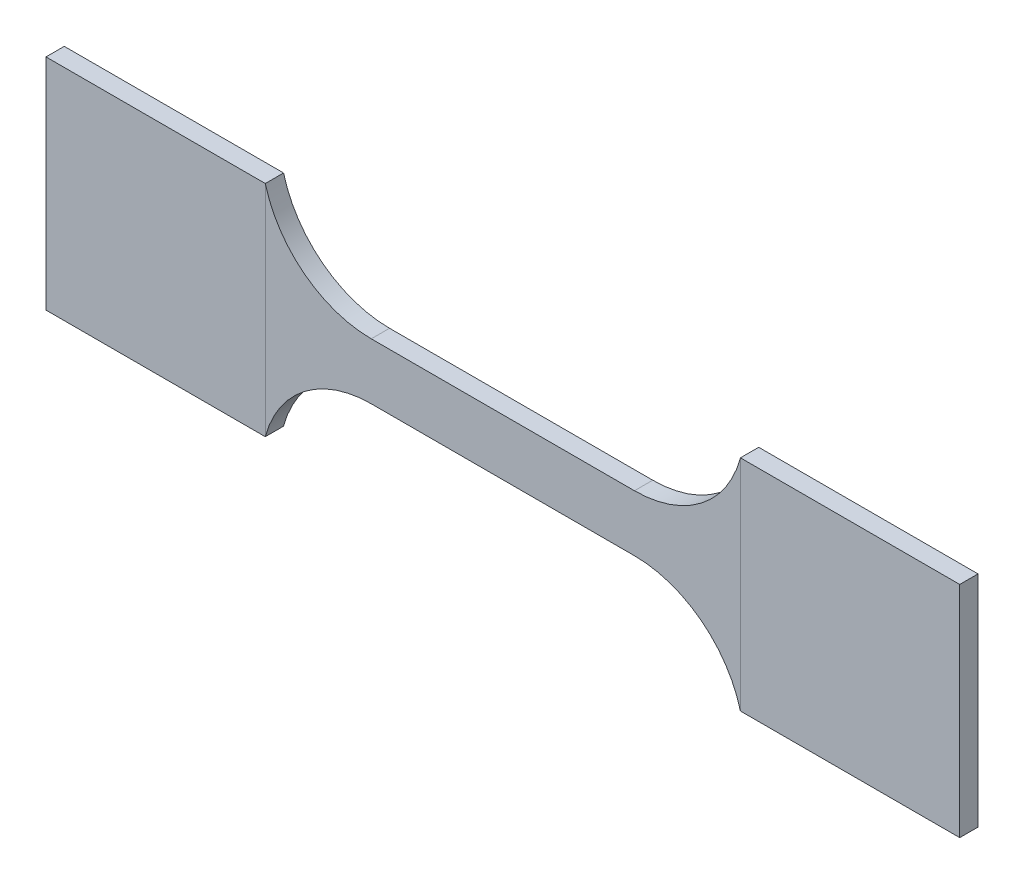
ISO-10303-21;
HEADER;
FILE_DESCRIPTION(('STEP AP214'),'2;1');
FILE_NAME('part.step','',(''),(''),'','','');
FILE_SCHEMA(('AUTOMOTIVE_DESIGN { 1 0 10303 214 1 1 1 1 }'));
ENDSEC;
DATA;
#1=APPLICATION_CONTEXT('core data for automotive mechanical design processes');
#2=APPLICATION_PROTOCOL_DEFINITION('international standard','automotive_design',2000,#1);
#3=PRODUCT_CONTEXT('',#1,'mechanical');
#4=PRODUCT('Part','Part','',(#3));
#5=PRODUCT_RELATED_PRODUCT_CATEGORY('part','',(#4));
#6=PRODUCT_DEFINITION_FORMATION('','',#4);
#7=PRODUCT_DEFINITION_CONTEXT('part definition',#1,'design');
#8=PRODUCT_DEFINITION('design','',#6,#7);
#9=PRODUCT_DEFINITION_SHAPE('','',#8);
#10=(LENGTH_UNIT() NAMED_UNIT(*) SI_UNIT(.MILLI.,.METRE.));
#11=(NAMED_UNIT(*) PLANE_ANGLE_UNIT() SI_UNIT($,.RADIAN.));
#12=(NAMED_UNIT(*) SI_UNIT($,.STERADIAN.) SOLID_ANGLE_UNIT());
#13=UNCERTAINTY_MEASURE_WITH_UNIT(LENGTH_MEASURE(1.E-05),#10,'distance_accuracy_value','');
#14=(GEOMETRIC_REPRESENTATION_CONTEXT(3) GLOBAL_UNCERTAINTY_ASSIGNED_CONTEXT((#13)) GLOBAL_UNIT_ASSIGNED_CONTEXT((#10,
#11,#12)) REPRESENTATION_CONTEXT('',''));
#15=CARTESIAN_POINT('',(0.,0.,0.));
#16=DIRECTION('',(0.,0.,1.));
#17=DIRECTION('',(1.,0.,0.));
#18=AXIS2_PLACEMENT_3D('',#15,#16,#17);
#19=CARTESIAN_POINT('',(7.80648251110733,36.82308604997,-0.01));
#20=DIRECTION('',(-1.,0.,0.));
#21=DIRECTION('',(0.,-1.,0.));
#22=AXIS2_PLACEMENT_3D('',#19,#20,#21);
#23=PLANE('',#22);
#24=DIRECTION('',(0.,1.,0.));
#25=VECTOR('',#24,1.);
#26=CARTESIAN_POINT('',(7.80648251110733,2.97308604996999,0.));
#27=LINE('',#26,#25);
#28=CARTESIAN_POINT('',(7.80648251110733,6.82308604996999,0.));
#29=VERTEX_POINT('',#28);
#30=CARTESIAN_POINT('',(7.80648251110733,36.82308604997,0.));
#31=VERTEX_POINT('',#30);
#32=EDGE_CURVE('E109',#29,#31,#27,.T.);
#33=ORIENTED_EDGE('',*,*,#32,.F.);
#34=DIRECTION('',(0.,0.,-1.));
#35=VECTOR('',#34,1.);
#36=CARTESIAN_POINT('',(7.80648251110733,6.82308604996999,2.5));
#37=LINE('',#36,#35);
#38=CARTESIAN_POINT('',(7.80648251110733,6.82308604996999,2.5));
#39=VERTEX_POINT('',#38);
#40=EDGE_CURVE('E68',#39,#29,#37,.T.);
#41=ORIENTED_EDGE('',*,*,#40,.F.);
#42=DIRECTION('',(0.,1.,0.));
#43=VECTOR('',#42,1.);
#44=CARTESIAN_POINT('',(7.80648251110733,2.97308604996999,2.5));
#45=LINE('',#44,#43);
#46=CARTESIAN_POINT('',(7.80648251110733,36.82308604997,2.5));
#47=VERTEX_POINT('',#46);
#48=EDGE_CURVE('E111',#39,#47,#45,.T.);
#49=ORIENTED_EDGE('',*,*,#48,.T.);
#50=DIRECTION('',(0.,0.,-1.));
#51=VECTOR('',#50,1.);
#52=CARTESIAN_POINT('',(7.80648251110733,36.82308604997,2.5));
#53=LINE('',#52,#51);
#54=EDGE_CURVE('E53',#47,#31,#53,.T.);
#55=ORIENTED_EDGE('',*,*,#54,.T.);
#56=EDGE_LOOP('',(#33,#41,#49,#55));
#57=FACE_BOUND('',#56,.T.);
#58=ADVANCED_FACE('F49',(#57),#23,.T.);
#59=CARTESIAN_POINT('',(37.8064825111073,6.82308604996999,2.5));
#60=DIRECTION('',(-1.,0.,0.));
#61=DIRECTION('',(0.,0.,1.));
#62=AXIS2_PLACEMENT_3D('',#59,#60,#61);
#63=PLANE('',#62);
#64=DIRECTION('',(0.,1.,0.));
#65=VECTOR('',#64,1.);
#66=CARTESIAN_POINT('',(37.8064825111073,6.82308604996999,0.));
#67=LINE('',#66,#65);
#68=CARTESIAN_POINT('',(37.8064825111073,6.82308604996999,0.));
#69=VERTEX_POINT('',#68);
#70=CARTESIAN_POINT('',(37.8064825111073,36.82308604997,0.));
#71=VERTEX_POINT('',#70);
#72=EDGE_CURVE('E60',#69,#71,#67,.T.);
#73=ORIENTED_EDGE('',*,*,#72,.T.);
#74=DIRECTION('',(0.,0.,-1.));
#75=VECTOR('',#74,1.);
#76=CARTESIAN_POINT('',(37.8064825111073,36.82308604997,2.5));
#77=LINE('',#76,#75);
#78=CARTESIAN_POINT('',(37.8064825111073,36.82308604997,2.5));
#79=VERTEX_POINT('',#78);
#80=EDGE_CURVE('E104',#79,#71,#77,.T.);
#81=ORIENTED_EDGE('',*,*,#80,.F.);
#82=DIRECTION('',(0.,1.,0.));
#83=VECTOR('',#82,1.);
#84=CARTESIAN_POINT('',(37.8064825111073,6.82308604996999,2.5));
#85=LINE('',#84,#83);
#86=CARTESIAN_POINT('',(37.8064825111073,6.82308604996999,2.5));
#87=VERTEX_POINT('',#86);
#88=EDGE_CURVE('E121',#87,#79,#85,.T.);
#89=ORIENTED_EDGE('',*,*,#88,.F.);
#90=DIRECTION('',(0.,0.,-1.));
#91=VECTOR('',#90,1.);
#92=CARTESIAN_POINT('',(37.8064825111073,6.82308604996999,2.5));
#93=LINE('',#92,#91);
#94=EDGE_CURVE('E118',#87,#69,#93,.T.);
#95=ORIENTED_EDGE('',*,*,#94,.T.);
#96=EDGE_LOOP('',(#73,#81,#89,#95));
#97=FACE_BOUND('',#96,.T.);
#98=ADVANCED_FACE('F133',(#97),#63,.F.);
#99=CARTESIAN_POINT('',(37.8064825111073,36.82308604997,2.5));
#100=DIRECTION('',(0.,-1.,0.));
#101=DIRECTION('',(0.,0.,-1.));
#102=AXIS2_PLACEMENT_3D('',#99,#100,#101);
#103=PLANE('',#102);
#104=DIRECTION('',(-1.,0.,0.));
#105=VECTOR('',#104,1.);
#106=CARTESIAN_POINT('',(37.8064825111073,36.82308604997,0.));
#107=LINE('',#106,#105);
#108=EDGE_CURVE('E99',#71,#31,#107,.T.);
#109=ORIENTED_EDGE('',*,*,#108,.T.);
#110=ORIENTED_EDGE('',*,*,#54,.F.);
#111=DIRECTION('',(-1.,0.,0.));
#112=VECTOR('',#111,1.);
#113=CARTESIAN_POINT('',(37.8064825111073,36.82308604997,2.5));
#114=LINE('',#113,#112);
#115=EDGE_CURVE('E124',#79,#47,#114,.T.);
#116=ORIENTED_EDGE('',*,*,#115,.F.);
#117=ORIENTED_EDGE('',*,*,#80,.T.);
#118=EDGE_LOOP('',(#109,#110,#116,#117));
#119=FACE_BOUND('',#118,.T.);
#120=ADVANCED_FACE('F101',(#119),#103,.F.);
#121=CARTESIAN_POINT('',(37.8064825111073,6.82308604996999,2.5));
#122=DIRECTION('',(0.,1.,0.));
#123=DIRECTION('',(0.,0.,1.));
#124=AXIS2_PLACEMENT_3D('',#121,#122,#123);
#125=PLANE('',#124);
#126=DIRECTION('',(1.,0.,0.));
#127=VECTOR('',#126,1.);
#128=CARTESIAN_POINT('',(37.8064825111073,6.82308604996999,0.));
#129=LINE('',#128,#127);
#130=EDGE_CURVE('E12',#29,#69,#129,.T.);
#131=ORIENTED_EDGE('',*,*,#130,.T.);
#132=ORIENTED_EDGE('',*,*,#94,.F.);
#133=DIRECTION('',(1.,0.,0.));
#134=VECTOR('',#133,1.);
#135=CARTESIAN_POINT('',(37.8064825111073,6.82308604996999,2.5));
#136=LINE('',#135,#134);
#137=EDGE_CURVE('E81',#39,#87,#136,.T.);
#138=ORIENTED_EDGE('',*,*,#137,.F.);
#139=ORIENTED_EDGE('',*,*,#40,.T.);
#140=EDGE_LOOP('',(#131,#132,#138,#139));
#141=FACE_BOUND('',#140,.T.);
#142=ADVANCED_FACE('F134',(#141),#125,.F.);
#143=CARTESIAN_POINT('',(-42.6910172733383,2.97308604996999,0.));
#144=DIRECTION('',(0.,0.,-1.));
#145=DIRECTION('',(-1.,0.,0.));
#146=AXIS2_PLACEMENT_3D('',#143,#144,#145);
#147=PLANE('',#146);
#148=ORIENTED_EDGE('',*,*,#130,.F.);
#149=ORIENTED_EDGE('',*,*,#32,.T.);
#150=ORIENTED_EDGE('',*,*,#108,.F.);
#151=ORIENTED_EDGE('',*,*,#72,.F.);
#152=EDGE_LOOP('',(#148,#149,#150,#151));
#153=FACE_BOUND('',#152,.T.);
#154=ADVANCED_FACE('F51',(#153),#147,.T.);
#155=CARTESIAN_POINT('',(-42.6910172733383,2.97308604996999,2.5));
#156=DIRECTION('',(0.,0.,-1.));
#157=DIRECTION('',(-1.,0.,0.));
#158=AXIS2_PLACEMENT_3D('',#155,#156,#157);
#159=PLANE('',#158);
#160=ORIENTED_EDGE('',*,*,#48,.F.);
#161=ORIENTED_EDGE('',*,*,#137,.T.);
#162=ORIENTED_EDGE('',*,*,#88,.T.);
#163=ORIENTED_EDGE('',*,*,#115,.T.);
#164=EDGE_LOOP('',(#160,#161,#162,#163));
#165=FACE_BOUND('',#164,.T.);
#166=ADVANCED_FACE('F141',(#165),#159,.F.);
#167=CLOSED_SHELL('',(#58,#98,#120,#142,#154,#166));
#168=MANIFOLD_SOLID_BREP('B2',#167);
#169=CARTESIAN_POINT('',(-57.1885170577839,36.82308604997,-0.01));
#170=DIRECTION('',(-1.,0.,0.));
#171=DIRECTION('',(0.,0.,1.));
#172=AXIS2_PLACEMENT_3D('',#169,#170,#171);
#173=PLANE('',#172);
#174=DIRECTION('',(0.,1.,0.));
#175=VECTOR('',#174,1.);
#176=CARTESIAN_POINT('',(-57.1885170577839,2.97308604996999,0.));
#177=LINE('',#176,#175);
#178=CARTESIAN_POINT('',(-57.1885170577839,6.82308604996999,0.));
#179=VERTEX_POINT('',#178);
#180=CARTESIAN_POINT('',(-57.1885170577839,36.82308604997,0.));
#181=VERTEX_POINT('',#180);
#182=EDGE_CURVE('E244',#179,#181,#177,.T.);
#183=ORIENTED_EDGE('',*,*,#182,.T.);
#184=DIRECTION('',(0.,0.,-1.));
#185=VECTOR('',#184,1.);
#186=CARTESIAN_POINT('',(-57.1885170577839,36.82308604997,2.5));
#187=LINE('',#186,#185);
#188=CARTESIAN_POINT('',(-57.1885170577839,36.82308604997,2.5));
#189=VERTEX_POINT('',#188);
#190=EDGE_CURVE('E212',#189,#181,#187,.T.);
#191=ORIENTED_EDGE('',*,*,#190,.F.);
#192=DIRECTION('',(0.,1.,0.));
#193=VECTOR('',#192,1.);
#194=CARTESIAN_POINT('',(-57.1885170577839,2.97308604996999,2.5));
#195=LINE('',#194,#193);
#196=CARTESIAN_POINT('',(-57.1885170577839,6.82308604996999,2.5));
#197=VERTEX_POINT('',#196);
#198=EDGE_CURVE('E229',#197,#189,#195,.T.);
#199=ORIENTED_EDGE('',*,*,#198,.F.);
#200=DIRECTION('',(0.,0.,-1.));
#201=VECTOR('',#200,1.);
#202=CARTESIAN_POINT('',(-57.1885170577839,6.82308604996999,2.5));
#203=LINE('',#202,#201);
#204=EDGE_CURVE('E197',#197,#179,#203,.T.);
#205=ORIENTED_EDGE('',*,*,#204,.T.);
#206=EDGE_LOOP('',(#183,#191,#199,#205));
#207=FACE_BOUND('',#206,.T.);
#208=ADVANCED_FACE('F193',(#207),#173,.F.);
#209=CARTESIAN_POINT('',(-87.1885170577839,6.82308604996999,2.5));
#210=DIRECTION('',(0.,1.,0.));
#211=DIRECTION('',(0.,0.,1.));
#212=AXIS2_PLACEMENT_3D('',#209,#210,#211);
#213=PLANE('',#212);
#214=DIRECTION('',(1.,0.,0.));
#215=VECTOR('',#214,1.);
#216=CARTESIAN_POINT('',(-87.1885170577839,6.82308604996999,0.));
#217=LINE('',#216,#215);
#218=CARTESIAN_POINT('',(-87.1885170577839,6.82308604996999,0.));
#219=VERTEX_POINT('',#218);
#220=EDGE_CURVE('E47',#219,#179,#217,.T.);
#221=ORIENTED_EDGE('',*,*,#220,.T.);
#222=ORIENTED_EDGE('',*,*,#204,.F.);
#223=DIRECTION('',(1.,0.,0.));
#224=VECTOR('',#223,1.);
#225=CARTESIAN_POINT('',(-87.1885170577839,6.82308604996999,2.5));
#226=LINE('',#225,#224);
#227=CARTESIAN_POINT('',(-87.1885170577839,6.82308604996999,2.5));
#228=VERTEX_POINT('',#227);
#229=EDGE_CURVE('E253',#228,#197,#226,.T.);
#230=ORIENTED_EDGE('',*,*,#229,.F.);
#231=DIRECTION('',(0.,0.,-1.));
#232=VECTOR('',#231,1.);
#233=CARTESIAN_POINT('',(-87.1885170577839,6.82308604996999,2.5));
#234=LINE('',#233,#232);
#235=EDGE_CURVE('E252',#228,#219,#234,.T.);
#236=ORIENTED_EDGE('',*,*,#235,.T.);
#237=EDGE_LOOP('',(#221,#222,#230,#236));
#238=FACE_BOUND('',#237,.T.);
#239=ADVANCED_FACE('F251',(#238),#213,.F.);
#240=CARTESIAN_POINT('',(-87.1885170577839,36.82308604997,2.5));
#241=DIRECTION('',(0.,-1.,0.));
#242=DIRECTION('',(0.,0.,-1.));
#243=AXIS2_PLACEMENT_3D('',#240,#241,#242);
#244=PLANE('',#243);
#245=DIRECTION('',(-1.,0.,0.));
#246=VECTOR('',#245,1.);
#247=CARTESIAN_POINT('',(-87.1885170577839,36.82308604997,0.));
#248=LINE('',#247,#246);
#249=CARTESIAN_POINT('',(-87.1885170577839,36.82308604997,0.));
#250=VERTEX_POINT('',#249);
#251=EDGE_CURVE('E203',#181,#250,#248,.T.);
#252=ORIENTED_EDGE('',*,*,#251,.T.);
#253=DIRECTION('',(0.,0.,-1.));
#254=VECTOR('',#253,1.);
#255=CARTESIAN_POINT('',(-87.1885170577839,36.82308604997,2.5));
#256=LINE('',#255,#254);
#257=CARTESIAN_POINT('',(-87.1885170577839,36.82308604997,2.5));
#258=VERTEX_POINT('',#257);
#259=EDGE_CURVE('E256',#258,#250,#256,.T.);
#260=ORIENTED_EDGE('',*,*,#259,.F.);
#261=DIRECTION('',(-1.,0.,0.));
#262=VECTOR('',#261,1.);
#263=CARTESIAN_POINT('',(-87.1885170577839,36.82308604997,2.5));
#264=LINE('',#263,#262);
#265=EDGE_CURVE('E225',#189,#258,#264,.T.);
#266=ORIENTED_EDGE('',*,*,#265,.F.);
#267=ORIENTED_EDGE('',*,*,#190,.T.);
#268=EDGE_LOOP('',(#252,#260,#266,#267));
#269=FACE_BOUND('',#268,.T.);
#270=ADVANCED_FACE('F267',(#269),#244,.F.);
#271=CARTESIAN_POINT('',(-87.1885170577839,6.82308604996999,2.5));
#272=DIRECTION('',(1.,0.,0.));
#273=DIRECTION('',(0.,0.,-1.));
#274=AXIS2_PLACEMENT_3D('',#271,#272,#273);
#275=PLANE('',#274);
#276=DIRECTION('',(0.,-1.,0.));
#277=VECTOR('',#276,1.);
#278=CARTESIAN_POINT('',(-87.1885170577839,6.82308604996999,0.));
#279=LINE('',#278,#277);
#280=EDGE_CURVE('E235',#250,#219,#279,.T.);
#281=ORIENTED_EDGE('',*,*,#280,.T.);
#282=ORIENTED_EDGE('',*,*,#235,.F.);
#283=DIRECTION('',(0.,-1.,0.));
#284=VECTOR('',#283,1.);
#285=CARTESIAN_POINT('',(-87.1885170577839,6.82308604996999,2.5));
#286=LINE('',#285,#284);
#287=EDGE_CURVE('E255',#258,#228,#286,.T.);
#288=ORIENTED_EDGE('',*,*,#287,.F.);
#289=ORIENTED_EDGE('',*,*,#259,.T.);
#290=EDGE_LOOP('',(#281,#282,#288,#289));
#291=FACE_BOUND('',#290,.T.);
#292=ADVANCED_FACE('F266',(#291),#275,.F.);
#293=CARTESIAN_POINT('',(-42.6910172733383,2.97308604996999,2.5));
#294=DIRECTION('',(0.,0.,-1.));
#295=DIRECTION('',(-1.,0.,0.));
#296=AXIS2_PLACEMENT_3D('',#293,#294,#295);
#297=PLANE('',#296);
#298=ORIENTED_EDGE('',*,*,#229,.T.);
#299=ORIENTED_EDGE('',*,*,#198,.T.);
#300=ORIENTED_EDGE('',*,*,#265,.T.);
#301=ORIENTED_EDGE('',*,*,#287,.T.);
#302=EDGE_LOOP('',(#298,#299,#300,#301));
#303=FACE_BOUND('',#302,.T.);
#304=ADVANCED_FACE('F195',(#303),#297,.F.);
#305=CARTESIAN_POINT('',(-42.6910172733383,2.97308604996999,0.));
#306=DIRECTION('',(0.,0.,-1.));
#307=DIRECTION('',(-1.,0.,0.));
#308=AXIS2_PLACEMENT_3D('',#305,#306,#307);
#309=PLANE('',#308);
#310=ORIENTED_EDGE('',*,*,#182,.F.);
#311=ORIENTED_EDGE('',*,*,#220,.F.);
#312=ORIENTED_EDGE('',*,*,#280,.F.);
#313=ORIENTED_EDGE('',*,*,#251,.F.);
#314=EDGE_LOOP('',(#310,#311,#312,#313));
#315=FACE_BOUND('',#314,.T.);
#316=ADVANCED_FACE('F250',(#315),#309,.T.);
#317=CLOSED_SHELL('',(#208,#239,#270,#292,#304,#316));
#318=MANIFOLD_SOLID_BREP('B6',#317);
#319=CARTESIAN_POINT('',(7.80648251110733,36.82308604997,-0.01));
#320=DIRECTION('',(-1.,0.,0.));
#321=DIRECTION('',(0.,-1.,0.));
#322=AXIS2_PLACEMENT_3D('',#319,#320,#321);
#323=PLANE('',#322);
#324=DIRECTION('',(0.,1.,0.));
#325=VECTOR('',#324,1.);
#326=CARTESIAN_POINT('',(7.80648251110733,2.97308604996999,0.));
#327=LINE('',#326,#325);
#328=CARTESIAN_POINT('',(7.80648251110733,6.82308604996999,0.));
#329=VERTEX_POINT('',#328);
#330=CARTESIAN_POINT('',(7.80648251110733,36.82308604997,0.));
#331=VERTEX_POINT('',#330);
#332=EDGE_CURVE('E399',#329,#331,#327,.T.);
#333=ORIENTED_EDGE('',*,*,#332,.T.);
#334=DIRECTION('',(0.,0.,-1.));
#335=VECTOR('',#334,1.);
#336=CARTESIAN_POINT('',(7.80648251110733,36.82308604997,2.5));
#337=LINE('',#336,#335);
#338=CARTESIAN_POINT('',(7.80648251110733,36.82308604997,2.5));
#339=VERTEX_POINT('',#338);
#340=EDGE_CURVE('E433',#339,#331,#337,.T.);
#341=ORIENTED_EDGE('',*,*,#340,.F.);
#342=DIRECTION('',(0.,1.,0.));
#343=VECTOR('',#342,1.);
#344=CARTESIAN_POINT('',(7.80648251110733,2.97308604996999,2.5));
#345=LINE('',#344,#343);
#346=CARTESIAN_POINT('',(7.80648251110733,6.82308604996999,2.5));
#347=VERTEX_POINT('',#346);
#348=EDGE_CURVE('E400',#347,#339,#345,.T.);
#349=ORIENTED_EDGE('',*,*,#348,.F.);
#350=DIRECTION('',(0.,0.,-1.));
#351=VECTOR('',#350,1.);
#352=CARTESIAN_POINT('',(7.80648251110733,6.82308604996999,2.5));
#353=LINE('',#352,#351);
#354=EDGE_CURVE('E324',#347,#329,#353,.T.);
#355=ORIENTED_EDGE('',*,*,#354,.T.);
#356=EDGE_LOOP('',(#333,#341,#349,#355));
#357=FACE_BOUND('',#356,.T.);
#358=ADVANCED_FACE('F316',(#357),#323,.F.);
#359=CARTESIAN_POINT('',(-57.1885170577839,36.82308604997,-0.01));
#360=DIRECTION('',(-1.,0.,0.));
#361=DIRECTION('',(0.,0.,1.));
#362=AXIS2_PLACEMENT_3D('',#359,#360,#361);
#363=PLANE('',#362);
#364=DIRECTION('',(0.,1.,0.));
#365=VECTOR('',#364,1.);
#366=CARTESIAN_POINT('',(-57.1885170577839,2.97308604996999,0.));
#367=LINE('',#366,#365);
#368=CARTESIAN_POINT('',(-57.1885170577839,6.82308604996999,0.));
#369=VERTEX_POINT('',#368);
#370=CARTESIAN_POINT('',(-57.1885170577839,36.82308604997,0.));
#371=VERTEX_POINT('',#370);
#372=EDGE_CURVE('E387',#369,#371,#367,.T.);
#373=ORIENTED_EDGE('',*,*,#372,.F.);
#374=DIRECTION('',(0.,0.,-1.));
#375=VECTOR('',#374,1.);
#376=CARTESIAN_POINT('',(-57.1885170577839,6.82308604996999,2.5));
#377=LINE('',#376,#375);
#378=CARTESIAN_POINT('',(-57.1885170577839,6.82308604996999,2.5));
#379=VERTEX_POINT('',#378);
#380=EDGE_CURVE('E384',#379,#369,#377,.T.);
#381=ORIENTED_EDGE('',*,*,#380,.F.);
#382=DIRECTION('',(0.,1.,0.));
#383=VECTOR('',#382,1.);
#384=CARTESIAN_POINT('',(-57.1885170577839,2.97308604996999,2.5));
#385=LINE('',#384,#383);
#386=CARTESIAN_POINT('',(-57.1885170577839,36.82308604997,2.5));
#387=VERTEX_POINT('',#386);
#388=EDGE_CURVE('E319',#379,#387,#385,.T.);
#389=ORIENTED_EDGE('',*,*,#388,.T.);
#390=DIRECTION('',(0.,0.,-1.));
#391=VECTOR('',#390,1.);
#392=CARTESIAN_POINT('',(-57.1885170577839,36.82308604997,2.5));
#393=LINE('',#392,#391);
#394=EDGE_CURVE('E191',#387,#371,#393,.T.);
#395=ORIENTED_EDGE('',*,*,#394,.T.);
#396=EDGE_LOOP('',(#373,#381,#389,#395));
#397=FACE_BOUND('',#396,.T.);
#398=ADVANCED_FACE('F386',(#397),#363,.T.);
#399=CARTESIAN_POINT('',(-42.6910172733383,17.97308604997,2.5));
#400=DIRECTION('',(0.,1.,0.));
#401=DIRECTION('',(0.,0.,1.));
#402=AXIS2_PLACEMENT_3D('',#399,#400,#401);
#403=PLANE('',#402);
#404=DIRECTION('',(1.,0.,0.));
#405=VECTOR('',#404,1.);
#406=CARTESIAN_POINT('',(-42.6910172733383,17.97308604997,0.));
#407=LINE('',#406,#405);
#408=CARTESIAN_POINT('',(-42.6910172733383,17.97308604997,0.));
#409=VERTEX_POINT('',#408);
#410=CARTESIAN_POINT('',(-6.69101727333827,17.97308604997,0.));
#411=VERTEX_POINT('',#410);
#412=EDGE_CURVE('E421',#409,#411,#407,.T.);
#413=ORIENTED_EDGE('',*,*,#412,.T.);
#414=DIRECTION('',(0.,0.,-1.));
#415=VECTOR('',#414,1.);
#416=CARTESIAN_POINT('',(-6.69101727333827,17.97308604997,2.5));
#417=LINE('',#416,#415);
#418=CARTESIAN_POINT('',(-6.69101727333827,17.97308604997,2.5));
#419=VERTEX_POINT('',#418);
#420=EDGE_CURVE('E435',#419,#411,#417,.T.);
#421=ORIENTED_EDGE('',*,*,#420,.F.);
#422=DIRECTION('',(1.,0.,0.));
#423=VECTOR('',#422,1.);
#424=CARTESIAN_POINT('',(-42.6910172733383,17.97308604997,2.5));
#425=LINE('',#424,#423);
#426=CARTESIAN_POINT('',(-42.6910172733383,17.97308604997,2.5));
#427=VERTEX_POINT('',#426);
#428=EDGE_CURVE('E404',#427,#419,#425,.T.);
#429=ORIENTED_EDGE('',*,*,#428,.F.);
#430=DIRECTION('',(0.,0.,-1.));
#431=VECTOR('',#430,1.);
#432=CARTESIAN_POINT('',(-42.6910172733383,17.97308604997,2.5));
#433=LINE('',#432,#431);
#434=EDGE_CURVE('E391',#427,#409,#433,.T.);
#435=ORIENTED_EDGE('',*,*,#434,.T.);
#436=EDGE_LOOP('',(#413,#421,#429,#435));
#437=FACE_BOUND('',#436,.T.);
#438=ADVANCED_FACE('F468',(#437),#403,.F.);
#439=CARTESIAN_POINT('',(-6.69101727333827,2.97308604996999,2.5));
#440=DIRECTION('',(0.,0.,-1.));
#441=DIRECTION('',(-1.,0.,0.));
#442=AXIS2_PLACEMENT_3D('',#439,#440,#441);
#443=CYLINDRICAL_SURFACE('',#442,15.);
#444=CARTESIAN_POINT('',(-6.69101727333827,2.97308604996999,0.));
#445=DIRECTION('',(0.,0.,-1.));
#446=DIRECTION('',(1.,0.,0.));
#447=AXIS2_PLACEMENT_3D('',#444,#445,#446);
#448=CIRCLE('',#447,15.);
#449=EDGE_CURVE('E423',#411,#329,#448,.T.);
#450=ORIENTED_EDGE('',*,*,#449,.T.);
#451=ORIENTED_EDGE('',*,*,#354,.F.);
#452=CARTESIAN_POINT('',(-6.69101727333827,2.97308604996999,2.5));
#453=DIRECTION('',(0.,0.,-1.));
#454=DIRECTION('',(1.,0.,0.));
#455=AXIS2_PLACEMENT_3D('',#452,#453,#454);
#456=CIRCLE('',#455,15.);
#457=EDGE_CURVE('E406',#419,#347,#456,.T.);
#458=ORIENTED_EDGE('',*,*,#457,.F.);
#459=ORIENTED_EDGE('',*,*,#420,.T.);
#460=EDGE_LOOP('',(#450,#451,#458,#459));
#461=FACE_BOUND('',#460,.T.);
#462=ADVANCED_FACE('F472',(#461),#443,.F.);
#463=CARTESIAN_POINT('',(-6.69101727333827,40.67308604997,2.5));
#464=DIRECTION('',(0.,0.,-1.));
#465=DIRECTION('',(-1.,0.,0.));
#466=AXIS2_PLACEMENT_3D('',#463,#464,#465);
#467=CYLINDRICAL_SURFACE('',#466,15.);
#468=CARTESIAN_POINT('',(-6.69101727333827,40.67308604997,0.));
#469=DIRECTION('',(0.,0.,-1.));
#470=DIRECTION('',(-1.,0.,0.));
#471=AXIS2_PLACEMENT_3D('',#468,#469,#470);
#472=CIRCLE('',#471,15.);
#473=CARTESIAN_POINT('',(-6.69101727333827,25.67308604997,0.));
#474=VERTEX_POINT('',#473);
#475=EDGE_CURVE('E426',#331,#474,#472,.T.);
#476=ORIENTED_EDGE('',*,*,#475,.T.);
#477=DIRECTION('',(0.,0.,-1.));
#478=VECTOR('',#477,1.);
#479=CARTESIAN_POINT('',(-6.69101727333827,25.67308604997,2.5));
#480=LINE('',#479,#478);
#481=CARTESIAN_POINT('',(-6.69101727333827,25.67308604997,2.5));
#482=VERTEX_POINT('',#481);
#483=EDGE_CURVE('E430',#482,#474,#480,.T.);
#484=ORIENTED_EDGE('',*,*,#483,.F.);
#485=CARTESIAN_POINT('',(-6.69101727333827,40.67308604997,2.5));
#486=DIRECTION('',(0.,0.,-1.));
#487=DIRECTION('',(-1.,0.,0.));
#488=AXIS2_PLACEMENT_3D('',#485,#486,#487);
#489=CIRCLE('',#488,15.);
#490=EDGE_CURVE('E413',#339,#482,#489,.T.);
#491=ORIENTED_EDGE('',*,*,#490,.F.);
#492=ORIENTED_EDGE('',*,*,#340,.T.);
#493=EDGE_LOOP('',(#476,#484,#491,#492));
#494=FACE_BOUND('',#493,.T.);
#495=ADVANCED_FACE('F447',(#494),#467,.F.);
#496=CARTESIAN_POINT('',(-42.6910172733383,25.67308604997,2.5));
#497=DIRECTION('',(0.,-1.,0.));
#498=DIRECTION('',(0.,0.,-1.));
#499=AXIS2_PLACEMENT_3D('',#496,#497,#498);
#500=PLANE('',#499);
#501=DIRECTION('',(-1.,0.,0.));
#502=VECTOR('',#501,1.);
#503=CARTESIAN_POINT('',(-42.6910172733383,25.67308604997,0.));
#504=LINE('',#503,#502);
#505=CARTESIAN_POINT('',(-42.6910172733383,25.67308604997,0.));
#506=VERTEX_POINT('',#505);
#507=EDGE_CURVE('E408',#474,#506,#504,.T.);
#508=ORIENTED_EDGE('',*,*,#507,.T.);
#509=DIRECTION('',(0.,0.,-1.));
#510=VECTOR('',#509,1.);
#511=CARTESIAN_POINT('',(-42.6910172733383,25.67308604997,2.5));
#512=LINE('',#511,#510);
#513=CARTESIAN_POINT('',(-42.6910172733383,25.67308604997,2.5));
#514=VERTEX_POINT('',#513);
#515=EDGE_CURVE('E418',#514,#506,#512,.T.);
#516=ORIENTED_EDGE('',*,*,#515,.F.);
#517=DIRECTION('',(-1.,0.,0.));
#518=VECTOR('',#517,1.);
#519=CARTESIAN_POINT('',(-42.6910172733383,25.67308604997,2.5));
#520=LINE('',#519,#518);
#521=EDGE_CURVE('E415',#482,#514,#520,.T.);
#522=ORIENTED_EDGE('',*,*,#521,.F.);
#523=ORIENTED_EDGE('',*,*,#483,.T.);
#524=EDGE_LOOP('',(#508,#516,#522,#523));
#525=FACE_BOUND('',#524,.T.);
#526=ADVANCED_FACE('F452',(#525),#500,.F.);
#527=CARTESIAN_POINT('',(-42.6910172733383,40.67308604997,2.5));
#528=DIRECTION('',(0.,0.,-1.));
#529=DIRECTION('',(-1.,0.,0.));
#530=AXIS2_PLACEMENT_3D('',#527,#528,#529);
#531=CYLINDRICAL_SURFACE('',#530,15.);
#532=CARTESIAN_POINT('',(-42.6910172733383,40.67308604997,0.));
#533=DIRECTION('',(0.,0.,-1.));
#534=DIRECTION('',(1.,0.,0.));
#535=AXIS2_PLACEMENT_3D('',#532,#533,#534);
#536=CIRCLE('',#535,15.);
#537=EDGE_CURVE('E339',#506,#371,#536,.T.);
#538=ORIENTED_EDGE('',*,*,#537,.T.);
#539=ORIENTED_EDGE('',*,*,#394,.F.);
#540=CARTESIAN_POINT('',(-42.6910172733383,40.67308604997,2.5));
#541=DIRECTION('',(0.,0.,-1.));
#542=DIRECTION('',(1.,0.,0.));
#543=AXIS2_PLACEMENT_3D('',#540,#541,#542);
#544=CIRCLE('',#543,15.);
#545=EDGE_CURVE('E398',#514,#387,#544,.T.);
#546=ORIENTED_EDGE('',*,*,#545,.F.);
#547=ORIENTED_EDGE('',*,*,#515,.T.);
#548=EDGE_LOOP('',(#538,#539,#546,#547));
#549=FACE_BOUND('',#548,.T.);
#550=ADVANCED_FACE('F453',(#549),#531,.F.);
#551=CARTESIAN_POINT('',(-42.6910172733383,2.97308604996999,2.5));
#552=DIRECTION('',(0.,0.,-1.));
#553=DIRECTION('',(-1.,0.,0.));
#554=AXIS2_PLACEMENT_3D('',#551,#552,#553);
#555=CYLINDRICAL_SURFACE('',#554,15.);
#556=CARTESIAN_POINT('',(-42.6910172733383,2.97308604996999,0.));
#557=DIRECTION('',(0.,0.,-1.));
#558=DIRECTION('',(-1.,0.,0.));
#559=AXIS2_PLACEMENT_3D('',#556,#557,#558);
#560=CIRCLE('',#559,15.);
#561=EDGE_CURVE('E419',#369,#409,#560,.T.);
#562=ORIENTED_EDGE('',*,*,#561,.T.);
#563=ORIENTED_EDGE('',*,*,#434,.F.);
#564=CARTESIAN_POINT('',(-42.6910172733383,2.97308604996999,2.5));
#565=DIRECTION('',(0.,0.,-1.));
#566=DIRECTION('',(-1.,0.,0.));
#567=AXIS2_PLACEMENT_3D('',#564,#565,#566);
#568=CIRCLE('',#567,15.);
#569=EDGE_CURVE('E395',#379,#427,#568,.T.);
#570=ORIENTED_EDGE('',*,*,#569,.F.);
#571=ORIENTED_EDGE('',*,*,#380,.T.);
#572=EDGE_LOOP('',(#562,#563,#570,#571));
#573=FACE_BOUND('',#572,.T.);
#574=ADVANCED_FACE('F401',(#573),#555,.F.);
#575=CARTESIAN_POINT('',(-42.6910172733383,2.97308604996999,0.));
#576=DIRECTION('',(0.,0.,-1.));
#577=DIRECTION('',(-1.,0.,0.));
#578=AXIS2_PLACEMENT_3D('',#575,#576,#577);
#579=PLANE('',#578);
#580=ORIENTED_EDGE('',*,*,#561,.F.);
#581=ORIENTED_EDGE('',*,*,#372,.T.);
#582=ORIENTED_EDGE('',*,*,#537,.F.);
#583=ORIENTED_EDGE('',*,*,#507,.F.);
#584=ORIENTED_EDGE('',*,*,#475,.F.);
#585=ORIENTED_EDGE('',*,*,#332,.F.);
#586=ORIENTED_EDGE('',*,*,#449,.F.);
#587=ORIENTED_EDGE('',*,*,#412,.F.);
#588=EDGE_LOOP('',(#580,#581,#582,#583,#584,#585,#586,#587));
#589=FACE_BOUND('',#588,.T.);
#590=ADVANCED_FACE('F460',(#589),#579,.T.);
#591=CARTESIAN_POINT('',(-42.6910172733383,2.97308604996999,2.5));
#592=DIRECTION('',(0.,0.,-1.));
#593=DIRECTION('',(-1.,0.,0.));
#594=AXIS2_PLACEMENT_3D('',#591,#592,#593);
#595=PLANE('',#594);
#596=ORIENTED_EDGE('',*,*,#388,.F.);
#597=ORIENTED_EDGE('',*,*,#569,.T.);
#598=ORIENTED_EDGE('',*,*,#428,.T.);
#599=ORIENTED_EDGE('',*,*,#457,.T.);
#600=ORIENTED_EDGE('',*,*,#348,.T.);
#601=ORIENTED_EDGE('',*,*,#490,.T.);
#602=ORIENTED_EDGE('',*,*,#521,.T.);
#603=ORIENTED_EDGE('',*,*,#545,.T.);
#604=EDGE_LOOP('',(#596,#597,#598,#599,#600,#601,#602,#603));
#605=FACE_BOUND('',#604,.T.);
#606=ADVANCED_FACE('F394',(#605),#595,.F.);
#607=CLOSED_SHELL('',(#358,#398,#438,#462,#495,#526,#550,#574,#590,#606));
#608=MANIFOLD_SOLID_BREP('B41',#607);
#609=ADVANCED_BREP_SHAPE_REPRESENTATION('',(#18,#168,#318,#608),#14);
#610=SHAPE_DEFINITION_REPRESENTATION(#9,#609);
ENDSEC;
END-ISO-10303-21;
